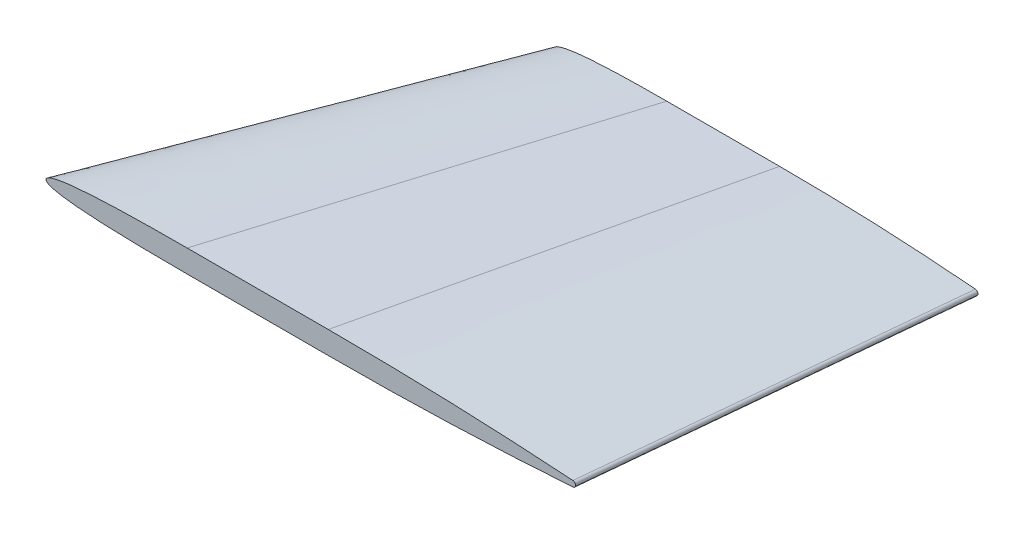
ISO-10303-21;
HEADER;
FILE_DESCRIPTION(('STEP AP214'),'2;1');
FILE_NAME('part.step','',(''),(''),'','','');
FILE_SCHEMA(('AUTOMOTIVE_DESIGN { 1 0 10303 214 1 1 1 1 }'));
ENDSEC;
DATA;
#1=APPLICATION_CONTEXT('core data for automotive mechanical design processes');
#2=APPLICATION_PROTOCOL_DEFINITION('international standard','automotive_design',2000,#1);
#3=PRODUCT_CONTEXT('',#1,'mechanical');
#4=PRODUCT('Part','Part','',(#3));
#5=PRODUCT_RELATED_PRODUCT_CATEGORY('part','',(#4));
#6=PRODUCT_DEFINITION_FORMATION('','',#4);
#7=PRODUCT_DEFINITION_CONTEXT('part definition',#1,'design');
#8=PRODUCT_DEFINITION('design','',#6,#7);
#9=PRODUCT_DEFINITION_SHAPE('','',#8);
#10=(LENGTH_UNIT() NAMED_UNIT(*) SI_UNIT(.MILLI.,.METRE.));
#11=(NAMED_UNIT(*) PLANE_ANGLE_UNIT() SI_UNIT($,.RADIAN.));
#12=(NAMED_UNIT(*) SI_UNIT($,.STERADIAN.) SOLID_ANGLE_UNIT());
#13=UNCERTAINTY_MEASURE_WITH_UNIT(LENGTH_MEASURE(1.E-05),#10,'distance_accuracy_value','');
#14=(GEOMETRIC_REPRESENTATION_CONTEXT(3) GLOBAL_UNCERTAINTY_ASSIGNED_CONTEXT((#13)) GLOBAL_UNIT_ASSIGNED_CONTEXT((#10,
#11,#12)) REPRESENTATION_CONTEXT('',''));
#15=CARTESIAN_POINT('',(0.,0.,0.));
#16=DIRECTION('',(0.,0.,1.));
#17=DIRECTION('',(1.,0.,0.));
#18=AXIS2_PLACEMENT_3D('',#15,#16,#17);
#19=CARTESIAN_POINT('',(0.,0.,0.));
#20=DIRECTION('',(0.,-1.,0.));
#21=DIRECTION('',(0.,0.,-1.));
#22=AXIS2_PLACEMENT_3D('',#19,#20,#21);
#23=PLANE('',#22);
#24=DIRECTION('',(-1.,0.,0.));
#25=VECTOR('',#24,1.);
#26=CARTESIAN_POINT('',(-33.3550389878657,0.,-28.8888888888889));
#27=LINE('',#26,#25);
#28=CARTESIAN_POINT('',(6.64496101213429,0.,-28.8888888888889));
#29=VERTEX_POINT('',#28);
#30=CARTESIAN_POINT('',(-13.3550389878657,0.,-28.8888888888889));
#31=VERTEX_POINT('',#30);
#32=EDGE_CURVE('E253',#29,#31,#27,.T.);
#33=ORIENTED_EDGE('',*,*,#32,.F.);
#34=DIRECTION('',(0.224164243499484,0.,-0.974551379833975));
#35=VECTOR('',#34,1.);
#36=CARTESIAN_POINT('',(-8.30620126516782,0.,36.1111111111111));
#37=LINE('',#36,#35);
#38=CARTESIAN_POINT('',(-8.30620126516782,0.,36.1111111111111));
#39=VERTEX_POINT('',#38);
#40=EDGE_CURVE('E264',#39,#29,#37,.T.);
#41=ORIENTED_EDGE('',*,*,#40,.F.);
#42=DIRECTION('',(1.,0.,0.));
#43=VECTOR('',#42,1.);
#44=CARTESIAN_POINT('',(-58.3062012651678,0.,36.1111111111111));
#45=LINE('',#44,#43);
#46=CARTESIAN_POINT('',(-33.3062012651678,0.,36.1111111111111));
#47=VERTEX_POINT('',#46);
#48=EDGE_CURVE('E237',#47,#39,#45,.T.);
#49=ORIENTED_EDGE('',*,*,#48,.F.);
#50=DIRECTION('',(0.293429624995853,0.,-0.955980677197397));
#51=VECTOR('',#50,1.);
#52=CARTESIAN_POINT('',(-23.3306201265168,0.,3.61111111111109));
#53=LINE('',#52,#51);
#54=EDGE_CURVE('E473',#47,#31,#53,.T.);
#55=ORIENTED_EDGE('',*,*,#54,.T.);
#56=EDGE_LOOP('',(#33,#41,#49,#55));
#57=FACE_BOUND('',#56,.T.);
#58=ADVANCED_FACE('F136',(#57),#23,.T.);
#59=CARTESIAN_POINT('',(0.,4.,0.));
#60=DIRECTION('',(0.,-1.,0.));
#61=DIRECTION('',(0.,0.,-1.));
#62=AXIS2_PLACEMENT_3D('',#59,#60,#61);
#63=PLANE('',#62);
#64=DIRECTION('',(1.,0.,0.));
#65=VECTOR('',#64,1.);
#66=CARTESIAN_POINT('',(-58.3062012651678,4.,36.1111111111111));
#67=LINE('',#66,#65);
#68=CARTESIAN_POINT('',(-33.3062012651678,4.,36.1111111111111));
#69=VERTEX_POINT('',#68);
#70=CARTESIAN_POINT('',(-8.30620126516782,4.,36.1111111111111));
#71=VERTEX_POINT('',#70);
#72=EDGE_CURVE('E220',#69,#71,#67,.T.);
#73=ORIENTED_EDGE('',*,*,#72,.T.);
#74=DIRECTION('',(0.224164243499484,0.,-0.974551379833975));
#75=VECTOR('',#74,1.);
#76=CARTESIAN_POINT('',(-0.830620126516762,4.,3.61111111111109));
#77=LINE('',#76,#75);
#78=CARTESIAN_POINT('',(6.64496101213429,4.,-28.8888888888889));
#79=VERTEX_POINT('',#78);
#80=EDGE_CURVE('E204',#71,#79,#77,.T.);
#81=ORIENTED_EDGE('',*,*,#80,.T.);
#82=DIRECTION('',(-1.,0.,0.));
#83=VECTOR('',#82,1.);
#84=CARTESIAN_POINT('',(-33.3550389878657,4.,-28.8888888888889));
#85=LINE('',#84,#83);
#86=CARTESIAN_POINT('',(-13.3550389878657,4.,-28.8888888888889));
#87=VERTEX_POINT('',#86);
#88=EDGE_CURVE('E230',#79,#87,#85,.T.);
#89=ORIENTED_EDGE('',*,*,#88,.T.);
#90=CARTESIAN_POINT('',(-33.3062012651678,4.,36.1111111111111));
#91=CARTESIAN_POINT('',(-26.6558138394004,4.,14.4444444444444));
#92=CARTESIAN_POINT('',(-20.0054264136331,4.,-7.22222222222225));
#93=CARTESIAN_POINT('',(-13.3550389878657,4.,-28.8888888888889));
#94=B_SPLINE_CURVE_WITH_KNOTS('',3,(#90,#91,#92,#93),.UNSPECIFIED.,.F.,.F.,(4,4),(0.,1.),.UNSPECIFIED.);
#95=EDGE_CURVE('E227',#69,#87,#94,.T.);
#96=ORIENTED_EDGE('',*,*,#95,.F.);
#97=EDGE_LOOP('',(#73,#81,#89,#96));
#98=FACE_BOUND('',#97,.T.);
#99=ADVANCED_FACE('F225',(#98),#63,.F.);
#100=CARTESIAN_POINT('',(-33.3550389878657,4.,-28.8888888888889));
#101=DIRECTION('',(0.,0.,1.));
#102=DIRECTION('',(1.,0.,0.));
#103=AXIS2_PLACEMENT_3D('',#100,#101,#102);
#104=PLANE('',#103);
#105=CARTESIAN_POINT('',(6.64496101213429,4.,-28.8888888888889));
#106=CARTESIAN_POINT('',(26.7075815989268,3.99999999999999,-28.8888888888889));
#107=CARTESIAN_POINT('',(46.6449610121343,2.,-28.8888888888889));
#108=B_SPLINE_CURVE_WITH_KNOTS('',2,(#105,#106,#107),.UNSPECIFIED.,.F.,.F.,(3,3),(0.,1.),.UNSPECIFIED.);
#109=CARTESIAN_POINT('',(41.3223081265053,2.49810714427976,-28.8888888888889));
#110=VERTEX_POINT('',#109);
#111=EDGE_CURVE('E210',#79,#110,#108,.T.);
#112=ORIENTED_EDGE('',*,*,#111,.T.);
#113=CARTESIAN_POINT('',(33.3909188699103,1.50109511793039,52.9875880510615));
#114=CARTESIAN_POINT('',(33.8556739532687,1.53204951907019,53.0325568196128));
#115=CARTESIAN_POINT('',(33.8556739532687,2.,53.0325568196128));
#116=CARTESIAN_POINT('',(33.8556739532687,2.46795048092982,53.0325568196128));
#117=CARTESIAN_POINT('',(33.3909188699103,2.49890488206961,52.9875880510615));
#118=CARTESIAN_POINT('',(33.9357903842561,1.50113400681733,47.3620957396136));
#119=CARTESIAN_POINT('',(34.4005594628321,1.53258671892999,47.4009833435175));
#120=CARTESIAN_POINT('',(34.399976481118,2.,47.4070086539737));
#121=CARTESIAN_POINT('',(34.4005594628321,2.46741328107001,47.4009833435175));
#122=CARTESIAN_POINT('',(33.9357903842561,2.49886599318267,47.3620957396136));
#123=CARTESIAN_POINT('',(34.4806618986018,1.50117289570427,41.7366034281658));
#124=CARTESIAN_POINT('',(34.9448616786437,1.53312334372344,41.7754384028916));
#125=CARTESIAN_POINT('',(34.9442790089672,2.,41.7814604883346));
#126=CARTESIAN_POINT('',(34.9448616786437,2.46687665627656,41.7754384028916));
#127=CARTESIAN_POINT('',(34.4806618986018,2.49882710429573,41.7366034281658));
#128=CARTESIAN_POINT('',(35.0255334129476,1.50121178459121,36.1111111167179));
#129=CARTESIAN_POINT('',(35.4885815368165,1.53365939437345,36.1559123226954));
#130=CARTESIAN_POINT('',(35.4885815368165,2.,36.1559123226954));
#131=CARTESIAN_POINT('',(35.4885815368165,2.46634060562655,36.1559123226954));
#132=CARTESIAN_POINT('',(35.0255334129476,2.49878821540879,36.1111111167179));
#133=CARTESIAN_POINT('',(35.2867326437982,1.50123190428566,33.4144493650578));
#134=CARTESIAN_POINT('',(35.7494258821313,1.53392954979268,33.459924526602));
#135=CARTESIAN_POINT('',(35.7494938182606,2.,33.4592223939301));
#136=CARTESIAN_POINT('',(35.7494258821313,2.46607045020731,33.459924526602));
#137=CARTESIAN_POINT('',(35.2867326437983,2.49876809571434,33.4144493650578));
#138=CARTESIAN_POINT('',(35.5479353498855,1.50125275150569,30.7177879478035));
#139=CARTESIAN_POINT('',(36.0103300733508,1.53420615287485,30.7632815439024));
#140=CARTESIAN_POINT('',(36.0104025827426,1.99999999999999,30.7625321087959));
#141=CARTESIAN_POINT('',(36.0103300733508,2.46579384712514,30.7632815439024));
#142=CARTESIAN_POINT('',(35.5479353498855,2.49874724849431,30.7177879478035));
#143=CARTESIAN_POINT('',(36.6152497979493,1.50134131200847,19.6989764110302));
#144=CARTESIAN_POINT('',(37.0757783590313,1.53536423514882,19.7509000070185));
#145=CARTESIAN_POINT('',(37.076484676427,1.99999999999999,19.7435995228866));
#146=CARTESIAN_POINT('',(37.0757783590313,2.46463576485116,19.7509000070186));
#147=CARTESIAN_POINT('',(36.6152497979493,2.49865868799153,19.6989764110302));
#148=CARTESIAN_POINT('',(37.4213939611922,1.50141606960295,11.3768294097564));
#149=CARTESIAN_POINT('',(37.8808035970569,1.53630562046833,11.4298464434921));
#150=CARTESIAN_POINT('',(37.8816251712741,2.,11.4213538896227));
#151=CARTESIAN_POINT('',(37.8808035970569,2.46369437953166,11.4298464434921));
#152=CARTESIAN_POINT('',(37.4213939611922,2.49858393039705,11.3768294097564));
#153=CARTESIAN_POINT('',(39.0337740359984,1.50158713911264,-5.2674557777585));
#154=CARTESIAN_POINT('',(39.4909887282472,1.53835617633487,-5.21462534636621));
#155=CARTESIAN_POINT('',(39.4918130935012,2.,-5.22314685663467));
#156=CARTESIAN_POINT('',(39.4909887282472,2.46164382366514,-5.21462534636622));
#157=CARTESIAN_POINT('',(39.0337740359984,2.49841286088736,-5.2674557777585));
#158=CARTESIAN_POINT('',(39.8400099475616,1.50168345102785,-13.5895939639995));
#159=CARTESIAN_POINT('',(40.2958762840673,1.53946465811955,-13.5352264391393));
#160=CARTESIAN_POINT('',(40.2968605208813,2.,-13.5454019696281));
#161=CARTESIAN_POINT('',(40.2958762840673,2.46053534188045,-13.5352264391394));
#162=CARTESIAN_POINT('',(39.8400099475616,2.49831654897215,-13.5895939639996));
#163=CARTESIAN_POINT('',(40.8716352268414,1.50182658103805,-24.2374476776984));
#164=CARTESIAN_POINT('',(41.3267354628827,1.54102411342373,-24.1926504852983));
#165=CARTESIAN_POINT('',(41.3268099641106,2.,-24.1934206782379));
#166=CARTESIAN_POINT('',(41.3267354628827,2.45897588657627,-24.1926504852983));
#167=CARTESIAN_POINT('',(40.8716352268414,2.49817341896195,-24.2374476776985));
#168=CARTESIAN_POINT('',(41.096969170969,1.50185905858814,-26.5631685215788));
#169=CARTESIAN_POINT('',(41.5516909964834,1.54137291731147,-26.5183783361045));
#170=CARTESIAN_POINT('',(41.5517683949961,2.,-26.5191785000808));
#171=CARTESIAN_POINT('',(41.5516909964834,2.45862708268853,-26.5183783361045));
#172=CARTESIAN_POINT('',(41.096969170969,2.49814094141186,-26.5631685215788));
#173=CARTESIAN_POINT('',(41.3223081212226,1.50189285529066,-28.8888888854068));
#174=CARTESIAN_POINT('',(41.7767217266876,1.54173089142601,-28.8449368442894));
#175=CARTESIAN_POINT('',(41.7767217266876,2.,-28.8449368442894));
#176=CARTESIAN_POINT('',(41.7767217266876,2.45826910857399,-28.8449368442894));
#177=CARTESIAN_POINT('',(41.3223081212226,2.49810714470934,-28.8888888854068));
#178=CARTESIAN_POINT('',(41.9033364257423,1.50198999615669,-34.8852941136153));
#179=CARTESIAN_POINT('',(42.3578244484341,1.54272126400079,-34.8532590438483));
#180=CARTESIAN_POINT('',(42.3566820617981,2.,-34.8414473163708));
#181=CARTESIAN_POINT('',(42.3578244484341,2.4572787359992,-34.8532590438483));
#182=CARTESIAN_POINT('',(41.9033364257423,2.49801000384331,-34.8852941136153));
#183=CARTESIAN_POINT('',(42.484364730262,1.50208713702272,-40.8816993418238));
#184=CARTESIAN_POINT('',(42.937783659534,1.54370968769194,-40.8497578942012));
#185=CARTESIAN_POINT('',(42.9366423969086,1.99999999999999,-40.8379577884522));
#186=CARTESIAN_POINT('',(42.937783659534,2.45629031230805,-40.8497578942012));
#187=CARTESIAN_POINT('',(42.484364730262,2.49791286297728,-40.8816993418238));
#188=CARTESIAN_POINT('',(43.0653930347817,1.50218427788875,-46.8781045700323));
#189=CARTESIAN_POINT('',(43.5166027320191,1.5446961682464,-46.8344682605337));
#190=CARTESIAN_POINT('',(43.5166027320191,1.99999999999999,-46.8344682605337));
#191=CARTESIAN_POINT('',(43.5166027320191,2.45530383175358,-46.8344682605337));
#192=CARTESIAN_POINT('',(43.0653930347817,2.49781572211125,-46.8781045700323));
#193=(BOUNDED_SURFACE() B_SPLINE_SURFACE(3,2,((#113,#114,#115,#116,#117),(#118,#119,#120,#121,
#122),(#123,#124,#125,#126,#127),(#128,#129,#130,#131,#132),(#133,#134,#135,#136,#137),(#138,
#139,#140,#141,#142),(#143,#144,#145,#146,#147),(#148,#149,#150,#151,#152),(#153,#154,#155,#156,
#157),(#158,#159,#160,#161,#162),(#163,#164,#165,#166,#167),(#168,#169,#170,#171,#172),(#173,
#174,#175,#176,#177),(#178,#179,#180,#181,#182),(#183,#184,#185,#186,#187),(#188,#189,#190,#191,
#192)),.UNSPECIFIED.,.F.,.F.,.F.) B_SPLINE_SURFACE_WITH_KNOTS((4,3,2,2,2,3,4),(3,2,3),(0.,
16.9554542718288,25.08330051281,50.1666010274149,75.2499015413038,82.2597354631119,
100.333202055722),(0.,0.5,1.),
.UNSPECIFIED.) GEOMETRIC_REPRESENTATION_ITEM() RATIONAL_B_SPLINE_SURFACE(((1.,0.730119470357136,
1.,0.730119470357136,1.),(1.,0.730510681446054,1.,0.730510681446054,1.),(1.,0.730901892534972,
1.,0.730901892534972,1.),(1.,0.73129310362389,1.,0.73129310362389,1.),(1.,0.731490237432423,1.,
0.731490237432423,1.),(1.,0.731692099676059,1.,0.731692099676059,1.),(1.,0.7325380447988,1.,
0.7325380447988,1.),(1.,0.733226179619518,1.,0.733226179619518,1.),(1.,0.734726728585382,1.,
0.734726728585382,1.),(1.,0.735539142730524,1.,0.735539142730524,1.),(1.,0.736682435951583,1.,
0.736682435951583,1.),(1.,0.736938494347952,1.,0.736938494347952,1.),(1.,0.737201306315002,1.,
0.737201306315002,1.),(1.,0.737928079445219,1.,0.737928079445219,1.),(1.,0.738654852575435,1.,
0.738654852575435,1.),(1.,0.739381625705651,1.,0.739381625705651,1.))) REPRESENTATION_ITEM('') SURFACE());
#194=CARTESIAN_POINT('',(41.3223081265053,2.49810714427976,-28.8888888888889));
#195=CARTESIAN_POINT('',(41.3505402720704,2.49567853364434,-28.8888888888889));
#196=CARTESIAN_POINT('',(41.3785559429119,2.49082722932282,-28.8888888888889));
#197=CARTESIAN_POINT('',(41.4333686906741,2.47651789198199,-28.8888888888889));
#198=CARTESIAN_POINT('',(41.4601664604544,2.46706251499781,-28.8888888888889));
#199=CARTESIAN_POINT('',(41.511805654467,2.44377422399758,-28.8888888888889));
#200=CARTESIAN_POINT('',(41.5366460417051,2.42993900881986,-28.8888888888889));
#201=CARTESIAN_POINT('',(41.5836387269361,2.3982892901109,-28.8888888888889));
#202=CARTESIAN_POINT('',(41.6057916714791,2.38047574663511,-28.8888888888889));
#203=CARTESIAN_POINT('',(41.646724303476,2.34141454320186,-28.8888888888889));
#204=CARTESIAN_POINT('',(41.665512200298,2.32017548776267,-28.8888888888889));
#205=CARTESIAN_POINT('',(41.6992393910847,2.27482918809371,-28.8888888888889));
#206=CARTESIAN_POINT('',(41.7141781693849,2.25072156019449,-28.8888888888889));
#207=CARTESIAN_POINT('',(41.7397062665268,2.2004433331789,-28.8888888888889));
#208=CARTESIAN_POINT('',(41.7503152188639,2.1742827024391,-28.8888888888889));
#209=CARTESIAN_POINT('',(41.7669717002757,2.12054924563584,-28.8888888888889));
#210=CARTESIAN_POINT('',(41.7730196030386,2.09297653546218,-28.8888888888889));
#211=CARTESIAN_POINT('',(41.7803628254913,2.03730963801455,-28.8888888888889));
#212=CARTESIAN_POINT('',(41.7816756751353,2.00921776202199,-28.8888888888889));
#213=CARTESIAN_POINT('',(41.7795602753897,1.95321314889351,-28.8888888888889));
#214=CARTESIAN_POINT('',(41.7761320536345,1.92530041071439,-28.8888888888889));
#215=CARTESIAN_POINT('',(41.7646413378686,1.87048414285943,-28.8888888888889));
#216=CARTESIAN_POINT('',(41.7565848921379,1.84357934476814,-28.8888888888889));
#217=CARTESIAN_POINT('',(41.7360770655952,1.79149976362352,-28.8888888888889));
#218=CARTESIAN_POINT('',(41.7236255274781,1.76632504253013,-28.8888888888889));
#219=CARTESIAN_POINT('',(41.6946614543826,1.71837270960812,-28.8888888888889));
#220=CARTESIAN_POINT('',(41.6781419642779,1.69559929964118,-28.8888888888889));
#221=CARTESIAN_POINT('',(41.6415286682265,1.65313602142374,-28.8888888888889));
#222=CARTESIAN_POINT('',(41.621434964174,1.6334460652998,-28.8888888888889));
#223=CARTESIAN_POINT('',(41.5781582768794,1.59762196567907,-28.8888888888889));
#224=CARTESIAN_POINT('',(41.5549630747096,1.58150259308385,-28.8888888888889));
#225=CARTESIAN_POINT('',(41.5062037710051,1.55336728674541,-28.8888888888889));
#226=CARTESIAN_POINT('',(41.4806400052036,1.54135077256847,-28.8888888888889));
#227=CARTESIAN_POINT('',(41.4330553781227,1.52367602593746,-28.8888888888889));
#228=CARTESIAN_POINT('',(41.4113218339911,1.51723328096708,-28.8888888888889));
#229=CARTESIAN_POINT('',(41.367208082177,1.50731722361928,-28.8888888888889));
#230=CARTESIAN_POINT('',(41.3448284658996,1.5038412793366,-28.8888888888889));
#231=CARTESIAN_POINT('',(41.3223081265053,1.50189285572024,-28.8888888888889));
#232=B_SPLINE_CURVE_WITH_KNOTS('',3,(#194,#195,#196,#197,#198,#199,#200,#201,#202,#203,#204,
#205,#206,#207,#208,#209,#210,#211,#212,#213,#214,#215,#216,#217,#218,#219,#220,#221,#222,#223,
#224,#225,#226,#227,#228,#229,#230,#231),.UNSPECIFIED.,.F.,.F.,(4,2,2,2,2,2,2,2,2,2,2,2,2,2,2,2,
2,2,4),(0.,0.084898538104682,0.169748157167299,0.254642430311183,0.339516238751376,
0.424180081843134,0.508855261416306,0.593142099355288,0.677422030897451,0.761389621981536,
0.84535672364235,0.929214343785458,1.01307496559094,1.09707997476887,1.1810825895038,
1.2654264750701,1.34975842351019,1.41756562240343,1.48531260553501),.UNSPECIFIED.);
#233=CARTESIAN_POINT('',(41.3223081265053,1.50189285572024,-28.8888888888889));
#234=VERTEX_POINT('',#233);
#235=EDGE_CURVE('E165',#110,#234,#232,.T.);
#236=ORIENTED_EDGE('',*,*,#235,.T.);
#237=CARTESIAN_POINT('',(6.64496101213429,0.,-28.8888888888889));
#238=CARTESIAN_POINT('',(26.7075815989268,0.,-28.8888888888889));
#239=CARTESIAN_POINT('',(46.6449610121343,2.,-28.8888888888889));
#240=B_SPLINE_CURVE_WITH_KNOTS('',2,(#237,#238,#239),.UNSPECIFIED.,.F.,.F.,(3,3),(0.,1.),.UNSPECIFIED.);
#241=EDGE_CURVE('E269',#29,#234,#240,.T.);
#242=ORIENTED_EDGE('',*,*,#241,.F.);
#243=ORIENTED_EDGE('',*,*,#32,.T.);
#244=CARTESIAN_POINT('',(-33.3550389878657,2.,-28.8888888888889));
#245=CARTESIAN_POINT('',(-33.4768817300547,-0.000156597654709864,-28.8888888888889));
#246=CARTESIAN_POINT('',(-13.3550389878657,0.,-28.8888888888889));
#247=B_SPLINE_CURVE_WITH_KNOTS('',2,(#244,#245,#246),.UNSPECIFIED.,.F.,.F.,(3,3),(0.,1.),.UNSPECIFIED.);
#248=CARTESIAN_POINT('',(-33.3550389878657,1.95213566414585,-28.8888888888889));
#249=VERTEX_POINT('',#248);
#250=EDGE_CURVE('E258',#249,#31,#247,.T.);
#251=ORIENTED_EDGE('',*,*,#250,.F.);
#252=DIRECTION('',(0.,-1.,0.));
#253=VECTOR('',#252,1.);
#254=CARTESIAN_POINT('',(-33.3550389878657,4.,-28.8888888888889));
#255=LINE('',#254,#253);
#256=CARTESIAN_POINT('',(-33.3550389878657,2.04786433585425,-28.8888888888889));
#257=VERTEX_POINT('',#256);
#258=EDGE_CURVE('E229',#257,#249,#255,.T.);
#259=ORIENTED_EDGE('',*,*,#258,.F.);
#260=CARTESIAN_POINT('',(-33.3550389878657,2.,-28.8888888888889));
#261=CARTESIAN_POINT('',(-33.4768817300547,4.00015659765471,-28.8888888888889));
#262=CARTESIAN_POINT('',(-13.3550389878657,4.,-28.8888888888889));
#263=B_SPLINE_CURVE_WITH_KNOTS('',2,(#260,#261,#262),.UNSPECIFIED.,.F.,.F.,(3,3),(0.,1.),.UNSPECIFIED.);
#264=EDGE_CURVE('E257',#257,#87,#263,.T.);
#265=ORIENTED_EDGE('',*,*,#264,.T.);
#266=ORIENTED_EDGE('',*,*,#88,.F.);
#267=EDGE_LOOP('',(#112,#236,#242,#243,#251,#259,#265,#266));
#268=FACE_BOUND('',#267,.T.);
#269=ADVANCED_FACE('F319',(#268),#104,.F.);
#270=CARTESIAN_POINT('',(-58.3062012651678,4.,36.1111111111111));
#271=DIRECTION('',(0.933580426497201,0.,0.358367949545301));
#272=DIRECTION('',(0.358367949545301,0.,-0.933580426497201));
#273=AXIS2_PLACEMENT_3D('',#270,#271,#272);
#274=PLANE('',#273);
#275=ORIENTED_EDGE('',*,*,#258,.T.);
#276=DIRECTION('',(0.358367864861597,-0.000687464561868342,-0.933580205888608));
#277=VECTOR('',#276,1.);
#278=CARTESIAN_POINT('',(-58.3062012651678,2.,36.1111111111111));
#279=LINE('',#278,#277);
#280=CARTESIAN_POINT('',(-58.3057212466994,2.00600220058824,36.1111111111111));
#281=VERTEX_POINT('',#280);
#282=EDGE_CURVE('E393',#281,#249,#279,.T.);
#283=ORIENTED_EDGE('',*,*,#282,.F.);
#284=CARTESIAN_POINT('',(-58.3062012651678,2.,36.1111111111111));
#285=CARTESIAN_POINT('',(-49.9891471727338,2.01595477861808,14.4444444444444));
#286=CARTESIAN_POINT('',(-41.6720930802997,2.03190955723617,-7.22222222222225));
#287=CARTESIAN_POINT('',(-33.3550389878657,2.04786433585425,-28.8888888888889));
#288=B_SPLINE_CURVE_WITH_KNOTS('',3,(#284,#285,#286,#287),.UNSPECIFIED.,.F.,.F.,(4,4),(0.,1.),.UNSPECIFIED.);
#289=EDGE_CURVE('E413',#281,#257,#288,.T.);
#290=ORIENTED_EDGE('',*,*,#289,.T.);
#291=EDGE_LOOP('',(#275,#283,#290));
#292=FACE_BOUND('',#291,.T.);
#293=ADVANCED_FACE('F362',(#292),#274,.F.);
#294=CARTESIAN_POINT('',(-58.3062012651678,4.,36.1111111111111));
#295=DIRECTION('',(0.,0.,-1.));
#296=DIRECTION('',(-1.,0.,0.));
#297=AXIS2_PLACEMENT_3D('',#294,#295,#296);
#298=PLANE('',#297);
#299=CARTESIAN_POINT('',(-8.30620126516782,0.,36.1111111111111));
#300=CARTESIAN_POINT('',(16.7498473667231,0.,36.1111111111111));
#301=CARTESIAN_POINT('',(41.6937987348322,2.,36.1111111111111));
#302=B_SPLINE_CURVE_WITH_KNOTS('',2,(#299,#300,#301),.UNSPECIFIED.,.F.,.F.,(3,3),(0.,1.),.UNSPECIFIED.);
#303=CARTESIAN_POINT('',(35.0255334183462,1.50121178492834,36.1111111111111));
#304=VERTEX_POINT('',#303);
#305=EDGE_CURVE('E261',#39,#304,#302,.T.);
#306=ORIENTED_EDGE('',*,*,#305,.T.);
#307=CARTESIAN_POINT('',(35.0255334183462,1.50121178492834,36.1111111111111));
#308=CARTESIAN_POINT('',(35.0538077425884,1.50315117254618,36.1111111111111));
#309=CARTESIAN_POINT('',(35.0819074689639,1.50751728396283,36.1111111111111));
#310=CARTESIAN_POINT('',(35.1369679680579,1.52087748133869,36.1111111111111));
#311=CARTESIAN_POINT('',(35.1639293917425,1.52986888233411,36.1111111111111));
#312=CARTESIAN_POINT('',(35.2159717172991,1.55226280527861,36.1111111111111));
#313=CARTESIAN_POINT('',(35.2410516281803,1.5656676320226,36.1111111111111));
#314=CARTESIAN_POINT('',(35.2885924803909,1.59650293694562,36.1111111111111));
#315=CARTESIAN_POINT('',(35.3110540473669,1.61393245045661,36.1111111111111));
#316=CARTESIAN_POINT('',(35.3526655705573,1.65228500302093,36.1111111111111));
#317=CARTESIAN_POINT('',(35.3718233417528,1.67319956113345,36.1111111111111));
#318=CARTESIAN_POINT('',(35.4063395440824,1.71796398243105,36.1111111111111));
#319=CARTESIAN_POINT('',(35.4216974670173,1.74181423760398,36.1111111111111));
#320=CARTESIAN_POINT('',(35.4480997517741,1.7916534689536,36.1111111111111));
#321=CARTESIAN_POINT('',(35.4591635289321,1.81763216001298,36.1111111111111));
#322=CARTESIAN_POINT('',(35.4767529014276,1.87108123600418,36.1111111111111));
#323=CARTESIAN_POINT('',(35.4832788676832,1.89855149881785,36.1111111111111));
#324=CARTESIAN_POINT('',(35.4915861870751,1.95409341398183,36.1111111111111));
#325=CARTESIAN_POINT('',(35.4933854522653,1.98216238839105,36.1111111111111));
#326=CARTESIAN_POINT('',(35.4922385390779,2.03820308837425,36.1111111111111));
#327=CARTESIAN_POINT('',(35.4892924055017,2.06617481486385,36.1111111111111));
#328=CARTESIAN_POINT('',(35.4787486928556,2.12118463362692,36.1111111111111));
#329=CARTESIAN_POINT('',(35.4711579107686,2.14822402930732,36.1111111111111));
#330=CARTESIAN_POINT('',(35.4515511228202,2.20064881390558,36.1111111111111));
#331=CARTESIAN_POINT('',(35.4395349025023,2.22603412259629,36.1111111111111));
#332=CARTESIAN_POINT('',(35.4114019940659,2.27447456543961,36.1111111111111));
#333=CARTESIAN_POINT('',(35.3952787827068,2.29752591033143,36.1111111111111));
#334=CARTESIAN_POINT('',(35.3594066087624,2.34060558974565,36.1111111111111));
#335=CARTESIAN_POINT('',(35.339657955273,2.36063418171517,36.1111111111111));
#336=CARTESIAN_POINT('',(35.2970137825936,2.39718705475182,36.1111111111111));
#337=CARTESIAN_POINT('',(35.2741062605721,2.41369732714511,36.1111111111111));
#338=CARTESIAN_POINT('',(35.2258510469051,2.44266026111046,36.1111111111111));
#339=CARTESIAN_POINT('',(35.2005031930424,2.45511265269978,36.1111111111111));
#340=CARTESIAN_POINT('',(35.1505363928739,2.4746544446352,36.1111111111111));
#341=CARTESIAN_POINT('',(35.1260695469524,2.48213540242532,36.1111111111111));
#342=CARTESIAN_POINT('',(35.0762938526513,2.49332553562059,36.1111111111111));
#343=CARTESIAN_POINT('',(35.0509851803436,2.49703549468803,36.1111111111111));
#344=CARTESIAN_POINT('',(35.0255334183462,2.49878821507166,36.1111111111111));
#345=B_SPLINE_CURVE_WITH_KNOTS('',3,(#307,#308,#309,#310,#311,#312,#313,#314,#315,#316,#317,
#318,#319,#320,#321,#322,#323,#324,#325,#326,#327,#328,#329,#330,#331,#332,#333,#334,#335,#336,
#337,#338,#339,#340,#341,#342,#343,#344),.UNSPECIFIED.,.F.,.F.,(4,2,2,2,2,2,2,2,2,2,2,2,2,2,2,2,
2,2,4),(0.,0.0849114096274301,0.169773584020257,0.254680145920221,0.339566377844655,
0.424248975702892,0.508942893063762,0.593249290189862,0.677548795350038,0.761528379686311,
0.845507171176327,0.929363360973853,1.01322361497298,1.09721790610086,1.18120503941358,
1.26552057662037,1.34984172244263,1.42630715515078,1.50275669410247),.UNSPECIFIED.);
#346=CARTESIAN_POINT('',(35.0255334183462,2.49878821507166,36.1111111111111));
#347=VERTEX_POINT('',#346);
#348=EDGE_CURVE('E13',#304,#347,#345,.T.);
#349=ORIENTED_EDGE('',*,*,#348,.T.);
#350=CARTESIAN_POINT('',(-8.30620126516782,4.,36.1111111111111));
#351=CARTESIAN_POINT('',(16.749847366723,4.,36.1111111111111));
#352=CARTESIAN_POINT('',(41.6937987348322,2.,36.1111111111111));
#353=B_SPLINE_CURVE_WITH_KNOTS('',2,(#350,#351,#352),.UNSPECIFIED.,.F.,.F.,(3,3),(0.,1.),.UNSPECIFIED.);
#354=EDGE_CURVE('E208',#71,#347,#353,.T.);
#355=ORIENTED_EDGE('',*,*,#354,.F.);
#356=ORIENTED_EDGE('',*,*,#72,.F.);
#357=CARTESIAN_POINT('',(-58.3062012651678,2.,36.1111111111111));
#358=CARTESIAN_POINT('',(-58.2981682863197,2.13185803387447,36.1111111111111));
#359=CARTESIAN_POINT('',(-58.1165495380854,2.3512782454784,36.1111111111111));
#360=CARTESIAN_POINT('',(-57.6523540562812,2.59937777239834,36.1111111111111));
#361=CARTESIAN_POINT('',(-57.0197515682006,2.80617439716223,36.111111111111));
#362=CARTESIAN_POINT('',(-56.3769150244662,2.95010416964718,36.1111111111111));
#363=CARTESIAN_POINT('',(-55.8568799760318,3.04843051159478,36.1111111111111));
#364=CARTESIAN_POINT('',(-55.3359662965872,3.13504754543367,36.1111111111111));
#365=CARTESIAN_POINT('',(-54.6818489795878,3.2286430482675,36.1111111111111));
#366=CARTESIAN_POINT('',(-53.6326085869534,3.35434667278868,36.111111111111));
#367=CARTESIAN_POINT('',(-52.3173026060738,3.47915567883608,36.1111111111111));
#368=CARTESIAN_POINT('',(-50.736341932929,3.59550791665806,36.1111111111111));
#369=CARTESIAN_POINT('',(-49.1537633268491,3.68800069592947,36.1111111111111));
#370=CARTESIAN_POINT('',(-47.5702823950901,3.76243746410943,36.1111111111111));
#371=CARTESIAN_POINT('',(-45.9861816087334,3.82258876530267,36.1111111111111));
#372=CARTESIAN_POINT('',(-44.4016961914234,3.87109571460881,36.111111111111));
#373=CARTESIAN_POINT('',(-42.8169399486991,3.90986090614081,36.1111111111111));
#374=CARTESIAN_POINT('',(-41.2320059940613,3.94034760640304,36.1111111111111));
#375=CARTESIAN_POINT('',(-39.1186009927976,3.97140917344184,36.1111111111111));
#376=CARTESIAN_POINT('',(-36.4766432024574,3.99460959973483,36.1111111111111));
#377=CARTESIAN_POINT('',(-34.3630212451883,4.,36.1111111111111));
#378=CARTESIAN_POINT('',(-33.3062012651678,4.,36.1111111111111));
#379=B_SPLINE_CURVE_WITH_KNOTS('',3,(#357,#358,#359,#360,#361,#362,#363,#364,#365,#366,#367,
#368,#369,#370,#371,#372,#373,#374,#375,#376,#377,#378),.UNSPECIFIED.,.F.,.F.,(4,1,1,1,1,1,1,1,
1,1,1,1,1,1,1,1,1,1,1,4),(0.474821972073358,0.48236939656901,0.489916821064662,
0.505011670055968,0.520106519047273,0.527653943542926,0.535201368038578,0.550296217029883,
0.565391066021188,0.595580764003799,0.625770461986409,0.655960159969019,0.68614985795163,
0.71633955593424,0.74652925391685,0.776718951899461,0.806908649882071,0.837098347864681,
0.897477743829902,0.957857139795123),.UNSPECIFIED.);
#380=EDGE_CURVE('E414',#281,#69,#379,.T.);
#381=ORIENTED_EDGE('',*,*,#380,.F.);
#382=CARTESIAN_POINT('',(-58.3062012651678,2.,36.1111111111111));
#383=CARTESIAN_POINT('',(-58.1843584223458,0.,36.1111111111111));
#384=CARTESIAN_POINT('',(-33.3062012651678,0.,36.1111111111111));
#385=B_SPLINE_CURVE_WITH_KNOTS('',2,(#382,#383,#384),.UNSPECIFIED.,.F.,.F.,(3,3),(0.,1.),.UNSPECIFIED.);
#386=EDGE_CURVE('E275',#281,#47,#385,.T.);
#387=ORIENTED_EDGE('',*,*,#386,.T.);
#388=ORIENTED_EDGE('',*,*,#48,.T.);
#389=EDGE_LOOP('',(#306,#349,#355,#356,#381,#387,#388));
#390=FACE_BOUND('',#389,.T.);
#391=ADVANCED_FACE('F218',(#390),#298,.F.);
#392=CARTESIAN_POINT('',(-33.3062012651678,4.,36.1111111111111));
#393=CARTESIAN_POINT('',(-26.6558138394004,4.,14.4444444444444));
#394=CARTESIAN_POINT('',(-20.0054264136331,4.,-7.22222222222225));
#395=CARTESIAN_POINT('',(-13.3550389878657,4.,-28.8888888888889));
#396=CARTESIAN_POINT('',(-34.3630212451883,4.,36.1111111111111));
#397=CARTESIAN_POINT('',(-27.6437050924178,4.00000220512109,14.4444444444444));
#398=CARTESIAN_POINT('',(-20.9243889396473,4.00000441024218,-7.22222222222225));
#399=CARTESIAN_POINT('',(-14.2050727868767,4.00000661536327,-28.8888888888889));
#400=CARTESIAN_POINT('',(-36.4766432024574,3.99460959973483,36.1111111111111));
#401=CARTESIAN_POINT('',(-29.6194695161449,3.99463775263086,14.4444444444444));
#402=CARTESIAN_POINT('',(-22.7622958298324,3.99466590552689,-7.22222222222229));
#403=CARTESIAN_POINT('',(-15.9051221435198,3.99469405842292,-28.888888888889));
#404=CARTESIAN_POINT('',(-39.1186009927976,3.97140917344184,36.1111111111111));
#405=CARTESIAN_POINT('',(-32.089098820084,3.97151779060535,14.4444444444444));
#406=CARTESIAN_POINT('',(-25.0595966473703,3.97162640776887,-7.22222222222222));
#407=CARTESIAN_POINT('',(-18.0300944746567,3.97173502493238,-28.8888888888889));
#408=CARTESIAN_POINT('',(-41.2320059940613,3.94034760640304,36.1111111111111));
#409=CARTESIAN_POINT('',(-34.0646305759387,3.94056543392277,14.4444444444444));
#410=CARTESIAN_POINT('',(-26.897255157816,3.94078326144251,-7.22222222222226));
#411=CARTESIAN_POINT('',(-19.7298797396933,3.94100108896224,-28.8888888888889));
#412=CARTESIAN_POINT('',(-42.8169399486991,3.90986090614081,36.1111111111111));
#413=CARTESIAN_POINT('',(-35.5461489412502,3.91016607124094,14.4444444444444));
#414=CARTESIAN_POINT('',(-28.2753579338012,3.91047123634108,-7.22222222222225));
#415=CARTESIAN_POINT('',(-21.0045669263523,3.91077640144122,-28.8888888888889));
#416=CARTESIAN_POINT('',(-44.4016961914234,3.87109571460881,36.111111111111));
#417=CARTESIAN_POINT('',(-37.0274797571859,3.87152600887994,14.4444444444444));
#418=CARTESIAN_POINT('',(-29.6532633229484,3.87195630315108,-7.22222222222225));
#419=CARTESIAN_POINT('',(-22.2790468887108,3.87238659742221,-28.8888888888889));
#420=CARTESIAN_POINT('',(-45.9861816087334,3.82258876530267,36.1111111111111));
#421=CARTESIAN_POINT('',(-38.5085131135605,3.8231342906061,14.4444444444445));
#422=CARTESIAN_POINT('',(-31.0308446183875,3.82367981590953,-7.22222222222224));
#423=CARTESIAN_POINT('',(-23.5531761232145,3.82422534121296,-28.8888888888889));
#424=CARTESIAN_POINT('',(-47.5702823950901,3.76243746410943,36.1111111111111));
#425=CARTESIAN_POINT('',(-39.9891437491009,3.7631572417232,14.4444444444444));
#426=CARTESIAN_POINT('',(-32.4080051031118,3.76387701933697,-7.22222222222224));
#427=CARTESIAN_POINT('',(-24.8268664571226,3.76459679695074,-28.8888888888889));
#428=CARTESIAN_POINT('',(-49.1537633268491,3.68800069592947,36.1111111111111));
#429=CARTESIAN_POINT('',(-41.4690859581669,3.68883193031736,14.4444444444444));
#430=CARTESIAN_POINT('',(-33.7844085894847,3.68966316470525,-7.22222222222226));
#431=CARTESIAN_POINT('',(-26.0997312208026,3.69049439909314,-28.888888888889));
#432=CARTESIAN_POINT('',(-50.736341932929,3.59550791665806,36.1111111111111));
#433=CARTESIAN_POINT('',(-42.9480945432847,3.59659226203683,14.4444444444444));
#434=CARTESIAN_POINT('',(-35.1598471536404,3.59767660741561,-7.22222222222222));
#435=CARTESIAN_POINT('',(-27.3715997639962,3.59876095279438,-28.8888888888889));
#436=CARTESIAN_POINT('',(-52.3173026060738,3.47915567883608,36.1111111111111));
#437=CARTESIAN_POINT('',(-44.4252767009301,3.48020530084008,14.4444444444444));
#438=CARTESIAN_POINT('',(-36.5332507957864,3.48125492284408,-7.22222222222225));
#439=CARTESIAN_POINT('',(-28.6412248906427,3.48230454484808,-28.8888888888889));
#440=CARTESIAN_POINT('',(-53.6326085869534,3.35434667278868,36.111111111111));
#441=CARTESIAN_POINT('',(-45.6540402137099,3.35574828371843,14.4444444444444));
#442=CARTESIAN_POINT('',(-37.6754718404665,3.35714989464818,-7.22222222222227));
#443=CARTESIAN_POINT('',(-29.696903467223,3.35855150557793,-28.8888888888889));
#444=CARTESIAN_POINT('',(-54.6818489795878,3.2286430482675,36.1111111111111));
#445=CARTESIAN_POINT('',(-46.6336881152799,3.22976733915845,14.4444444444445));
#446=CARTESIAN_POINT('',(-38.585527250972,3.2308916300494,-7.22222222222223));
#447=CARTESIAN_POINT('',(-30.5373663866641,3.23201592094035,-28.8888888888889));
#448=CARTESIAN_POINT('',(-55.3359662965872,3.13504754543367,36.1111111111111));
#449=CARTESIAN_POINT('',(-47.2440557080312,3.13601287809875,14.4444444444444));
#450=CARTESIAN_POINT('',(-39.1521451194752,3.13697821076383,-7.22222222222225));
#451=CARTESIAN_POINT('',(-31.0602345309192,3.1379435434289,-28.8888888888889));
#452=CARTESIAN_POINT('',(-55.8568799760318,3.04843051159478,36.1111111111111));
#453=CARTESIAN_POINT('',(-47.730134522456,3.04948159612638,14.4444444444444));
#454=CARTESIAN_POINT('',(-39.6033890688803,3.05053268065798,-7.22222222222224));
#455=CARTESIAN_POINT('',(-31.4766436153046,3.05158376518958,-28.8888888888889));
#456=CARTESIAN_POINT('',(-56.3769150244662,2.95010416964718,36.1111111111111));
#457=CARTESIAN_POINT('',(-48.2147587346793,2.9514713601396,14.4444444444444));
#458=CARTESIAN_POINT('',(-40.0526024448925,2.95283855063201,-7.22222222222225));
#459=CARTESIAN_POINT('',(-31.8904461551057,2.95420574112442,-28.8888888888889));
#460=CARTESIAN_POINT('',(-57.0197515682006,2.80617439716223,36.111111111111));
#461=CARTESIAN_POINT('',(-48.813261570947,2.80579697626944,14.4444444444444));
#462=CARTESIAN_POINT('',(-40.6067715736933,2.80541955537664,-7.22222222222228));
#463=CARTESIAN_POINT('',(-32.4002815764396,2.80504213448384,-28.8888888888889));
#464=CARTESIAN_POINT('',(-57.6523540562812,2.59937777239834,36.1111111111111));
#465=CARTESIAN_POINT('',(-49.3993956065292,2.59998699851085,14.4444444444444));
#466=CARTESIAN_POINT('',(-41.1464371567771,2.60059622462336,-7.22222222222223));
#467=CARTESIAN_POINT('',(-32.8934787070251,2.60120545073587,-28.8888888888889));
#468=CARTESIAN_POINT('',(-58.1165495380854,2.3512782454784,36.1111111111111));
#469=CARTESIAN_POINT('',(-49.824409364931,2.35063249142876,14.4444444444444));
#470=CARTESIAN_POINT('',(-41.5322691917765,2.34998673737913,-7.22222222222223));
#471=CARTESIAN_POINT('',(-33.240129018622,2.34934098332949,-28.8888888888889));
#472=CARTESIAN_POINT('',(-58.2981682863197,2.13185803387447,36.1111111111111));
#473=CARTESIAN_POINT('',(-49.9816121539776,2.13921107432172,14.4444444444444));
#474=CARTESIAN_POINT('',(-41.6650560216354,2.14656411476897,-7.22222222222225));
#475=CARTESIAN_POINT('',(-33.3484998892933,2.15391715521622,-28.8888888888889));
#476=CARTESIAN_POINT('',(-58.3062012651678,2.,36.1111111111111));
#477=CARTESIAN_POINT('',(-49.9891471727338,2.01595477861808,14.4444444444444));
#478=CARTESIAN_POINT('',(-41.6720930802997,2.03190955723617,-7.22222222222225));
#479=CARTESIAN_POINT('',(-33.3550389878657,2.04786433585425,-28.8888888888889));
#480=B_SPLINE_SURFACE_WITH_KNOTS('',3,3,((#392,#393,#394,#395),(#396,#397,#398,#399),(#400,#401,
#402,#403),(#404,#405,#406,#407),(#408,#409,#410,#411),(#412,#413,#414,#415),(#416,#417,#418,
#419),(#420,#421,#422,#423),(#424,#425,#426,#427),(#428,#429,#430,#431),(#432,#433,#434,#435),
(#436,#437,#438,#439),(#440,#441,#442,#443),(#444,#445,#446,#447),(#448,#449,#450,#451),(#452,
#453,#454,#455),(#456,#457,#458,#459),(#460,#461,#462,#463),(#464,#465,#466,#467),(#468,#469,
#470,#471),(#472,#473,#474,#475),(#476,#477,#478,#479)),.UNSPECIFIED.,.F.,.F.,.F.,(4,1,1,1,1,1,
1,1,1,1,1,1,1,1,1,1,1,1,1,4),(4,4),(0.474821972073358,0.535201368038578,0.595580764003799,
0.625770461986409,0.655960159969019,0.68614985795163,0.71633955593424,0.74652925391685,
0.776718951899461,0.806908649882071,0.837098347864682,0.867288045847292,0.882382894838597,
0.897477743829902,0.905025168325555,0.912572592821207,0.927667441812512,0.942762290803818,
0.95030971529947,0.957857139795123),(0.,1.),.UNSPECIFIED.);
#481=ORIENTED_EDGE('',*,*,#380,.T.);
#482=ORIENTED_EDGE('',*,*,#95,.T.);
#483=ORIENTED_EDGE('',*,*,#264,.F.);
#484=ORIENTED_EDGE('',*,*,#289,.F.);
#485=EDGE_LOOP('',(#481,#482,#483,#484));
#486=FACE_BOUND('',#485,.T.);
#487=ADVANCED_FACE('F361',(#486),#480,.F.);
#488=CARTESIAN_POINT('',(-58.3062012651678,2.,36.1111111111111));
#489=CARTESIAN_POINT('',(-33.3550389878654,1.95213566414587,-28.8888888888889));
#490=CARTESIAN_POINT('',(-58.2994891594274,1.88982355327673,36.1111111111111));
#491=CARTESIAN_POINT('',(-33.3495781430853,1.86357024818754,-28.8888888888889));
#492=CARTESIAN_POINT('',(-58.1797118547914,1.71483026010469,36.1111111111111));
#493=CARTESIAN_POINT('',(-33.2853467954152,1.72156531285855,-28.8888888888889));
#494=CARTESIAN_POINT('',(-57.9915085825288,1.58771297143912,36.111111111111));
#495=CARTESIAN_POINT('',(-33.1498888354562,1.59383966696533,-28.888888888889));
#496=CARTESIAN_POINT('',(-57.6871737102998,1.41706478927899,36.1111111111109));
#497=CARTESIAN_POINT('',(-32.9191140279181,1.42076447327975,-28.888888888889));
#498=CARTESIAN_POINT('',(-57.4087532189502,1.31941788385268,36.111111111111));
#499=CARTESIAN_POINT('',(-32.704143645918,1.31935502238824,-28.8888888888889));
#500=CARTESIAN_POINT('',(-56.8224731841386,1.14724420391475,36.1111111111111));
#501=CARTESIAN_POINT('',(-32.2438357694062,1.14580593328467,-28.8888888888889));
#502=CARTESIAN_POINT('',(-56.4174029453951,1.05805299677177,36.1111111111112));
#503=CARTESIAN_POINT('',(-31.9226136137301,1.0553587464075,-28.8888888888889));
#504=CARTESIAN_POINT('',(-55.413917327172,0.868394201503319,36.1111111111113));
#505=CARTESIAN_POINT('',(-31.1233651318233,0.865228030993127,-28.888888888889));
#506=CARTESIAN_POINT('',(-54.7024860485952,0.771713981849287,36.1111111111111));
#507=CARTESIAN_POINT('',(-30.5541063775974,0.767824890997308,-28.8888888888889));
#508=CARTESIAN_POINT('',(-53.4089296733141,0.62424270678325,36.1111111111111));
#509=CARTESIAN_POINT('',(-29.5172974225408,0.620511658809497,-28.8888888888888));
#510=CARTESIAN_POINT('',(-52.7143661358188,0.559394453392354,36.1111111111111));
#511=CARTESIAN_POINT('',(-28.9599300336634,0.555742542606767,-28.8888888888889));
#512=CARTESIAN_POINT('',(-50.403233054827,0.370972220816656,36.1111111111111));
#513=CARTESIAN_POINT('',(-27.1042956215246,0.368189072122527,-28.888888888889));
#514=CARTESIAN_POINT('',(-48.6800516201006,0.2821612885409,36.1111111111111));
#515=CARTESIAN_POINT('',(-25.7191507911181,0.279702245265192,-28.888888888889));
#516=CARTESIAN_POINT('',(-42.4428319514685,0.0348267109092653,36.1111111111111));
#517=CARTESIAN_POINT('',(-20.7043317144599,0.0344574407726232,-28.888888888889));
#518=CARTESIAN_POINT('',(-37.8597794710717,0.,36.1111111111111));
#519=CARTESIAN_POINT('',(-17.0176267331655,-2.85039823854423E-05,-28.8888888888889));
#520=CARTESIAN_POINT('',(-33.3062012651678,0.,36.1111111111111));
#521=CARTESIAN_POINT('',(-13.3550389878657,0.,-28.8888888888889));
#522=B_SPLINE_SURFACE_WITH_KNOTS('',3,1,((#488,#489),(#490,#491),(#492,#493),(#494,#495),(#496,
#497),(#498,#499),(#500,#501),(#502,#503),(#504,#505),(#506,#507),(#508,#509),(#510,#511),(#512,
#513),(#514,#515),(#516,#517),(#518,#519),(#520,#521)),.UNSPECIFIED.,.F.,.F.,.F.,(4,1,1,1,1,1,1,
1,1,1,1,1,1,1,4),(2,2),(0.,0.0130335558260233,0.0236646502785041,0.0266955686063861,
0.0543505595370665,0.0583998105935825,0.0988700618423397,0.103365340270874,0.179200697813376,
0.18376572265506,0.257356535356877,0.261699707252356,0.458038546790629,0.461404466887766,1.),
(0.,1.),.UNSPECIFIED.);
#523=ORIENTED_EDGE('',*,*,#386,.F.);
#524=ORIENTED_EDGE('',*,*,#282,.T.);
#525=ORIENTED_EDGE('',*,*,#250,.T.);
#526=ORIENTED_EDGE('',*,*,#54,.F.);
#527=EDGE_LOOP('',(#523,#524,#525,#526));
#528=FACE_BOUND('',#527,.T.);
#529=ADVANCED_FACE('F336',(#528),#522,.F.);
#530=CARTESIAN_POINT('',(-8.30620126516782,0.,36.1111111111111));
#531=CARTESIAN_POINT('',(6.64496101213429,0.,-28.8888888888889));
#532=CARTESIAN_POINT('',(16.7498473667231,0.,36.1111111111111));
#533=CARTESIAN_POINT('',(26.7075815989268,0.,-28.8888888888889));
#534=CARTESIAN_POINT('',(41.6937987348322,2.,36.1111111111111));
#535=CARTESIAN_POINT('',(46.6449610121343,2.,-28.8888888888889));
#536=B_SPLINE_SURFACE_WITH_KNOTS('',2,1,((#530,#531),(#532,#533),(#534,#535)),.UNSPECIFIED.,.F.,
.F.,.F.,(3,3),(2,2),(0.,1.),(0.,1.),.UNSPECIFIED.);
#537=CARTESIAN_POINT('',(43.0653930347817,1.50218427788875,-46.8781045700323));
#538=CARTESIAN_POINT('',(42.484364730262,1.50208713702272,-40.8816993418238));
#539=CARTESIAN_POINT('',(41.9033364257423,1.50198999615669,-34.8852941136153));
#540=CARTESIAN_POINT('',(41.3223081212226,1.50189285529066,-28.8888888854068));
#541=CARTESIAN_POINT('',(41.096969170969,1.50185905858814,-26.5631685215788));
#542=CARTESIAN_POINT('',(40.8716352268414,1.50182658103805,-24.2374476776984));
#543=CARTESIAN_POINT('',(39.8400099475616,1.50168345102785,-13.5895939639996));
#544=CARTESIAN_POINT('',(39.0337740359984,1.50158713911264,-5.2674557777585));
#545=CARTESIAN_POINT('',(37.4213939611922,1.50141606960295,11.3768294097564));
#546=CARTESIAN_POINT('',(36.6152497979493,1.50134131200847,19.6989764110302));
#547=CARTESIAN_POINT('',(35.5479353498855,1.50125275150569,30.7177879478035));
#548=CARTESIAN_POINT('',(35.2867326437982,1.50123190428566,33.4144493650578));
#549=CARTESIAN_POINT('',(35.0255334129476,1.50121178459121,36.1111111167179));
#550=CARTESIAN_POINT('',(34.4806618986018,1.50117289570427,41.7366034281658));
#551=CARTESIAN_POINT('',(33.9357903842561,1.50113400681733,47.3620957396136));
#552=CARTESIAN_POINT('',(33.3909188699103,1.50109511793039,52.9875880510615));
#553=B_SPLINE_CURVE_WITH_KNOTS('',3,(#537,#538,#539,#540,#541,#542,#543,#544,#545,#546,#547,
#548,#549,#550,#551,#552),.UNSPECIFIED.,.F.,.F.,(4,3,2,2,2,3,4),(0.,18.0734665926099,
25.0833005144181,50.1666010283069,75.2499015429118,83.377747783893,100.333202055722),.UNSPECIFIED.);
#554=EDGE_CURVE('E151',#234,#304,#553,.T.);
#555=ORIENTED_EDGE('',*,*,#241,.T.);
#556=ORIENTED_EDGE('',*,*,#554,.T.);
#557=ORIENTED_EDGE('',*,*,#305,.F.);
#558=ORIENTED_EDGE('',*,*,#40,.T.);
#559=EDGE_LOOP('',(#555,#556,#557,#558));
#560=FACE_BOUND('',#559,.T.);
#561=ADVANCED_FACE('F330',(#560),#536,.F.);
#562=CARTESIAN_POINT('',(41.6937987348322,2.,36.1111111111111));
#563=CARTESIAN_POINT('',(46.6449610121343,2.,-28.8888888888889));
#564=CARTESIAN_POINT('',(16.749847366723,4.,36.1111111111111));
#565=CARTESIAN_POINT('',(26.7075815989268,3.99999999999999,-28.8888888888889));
#566=CARTESIAN_POINT('',(-8.30620126516782,4.,36.1111111111111));
#567=CARTESIAN_POINT('',(6.64496101213429,4.,-28.8888888888889));
#568=B_SPLINE_SURFACE_WITH_KNOTS('',2,1,((#562,#563),(#564,#565),(#566,#567)),.UNSPECIFIED.,.F.,
.F.,.F.,(3,3),(2,2),(0.,1.),(0.,1.),.UNSPECIFIED.);
#569=CARTESIAN_POINT('',(33.3909188699103,2.49890488206961,52.9875880510615));
#570=CARTESIAN_POINT('',(33.9357903842561,2.49886599318267,47.3620957396136));
#571=CARTESIAN_POINT('',(34.4806618986018,2.49882710429573,41.7366034281658));
#572=CARTESIAN_POINT('',(35.0255334129476,2.49878821540879,36.1111111167179));
#573=CARTESIAN_POINT('',(35.2867326437983,2.49876809571434,33.4144493650578));
#574=CARTESIAN_POINT('',(35.5479353498855,2.49874724849431,30.7177879478035));
#575=CARTESIAN_POINT('',(36.6152497979493,2.49865868799153,19.6989764110302));
#576=CARTESIAN_POINT('',(37.4213939611922,2.49858393039705,11.3768294097564));
#577=CARTESIAN_POINT('',(39.0337740359984,2.49841286088736,-5.2674557777585));
#578=CARTESIAN_POINT('',(39.8400099475616,2.49831654897215,-13.5895939639996));
#579=CARTESIAN_POINT('',(40.8716352268414,2.49817341896195,-24.2374476776985));
#580=CARTESIAN_POINT('',(41.096969170969,2.49814094141186,-26.5631685215788));
#581=CARTESIAN_POINT('',(41.3223081212226,2.49810714470934,-28.8888888854068));
#582=CARTESIAN_POINT('',(41.9033364257423,2.49801000384331,-34.8852941136153));
#583=CARTESIAN_POINT('',(42.484364730262,2.49791286297728,-40.8816993418238));
#584=CARTESIAN_POINT('',(43.0653930347817,2.49781572211125,-46.8781045700323));
#585=B_SPLINE_CURVE_WITH_KNOTS('',3,(#569,#570,#571,#572,#573,#574,#575,#576,#577,#578,#579,
#580,#581,#582,#583,#584),.UNSPECIFIED.,.F.,.F.,(4,3,2,2,2,3,4),(0.,16.9554542718288,
25.08330051281,50.1666010274149,75.2499015413038,82.2597354631119,100.333202055722),.UNSPECIFIED.);
#586=EDGE_CURVE('E235',#347,#110,#585,.T.);
#587=ORIENTED_EDGE('',*,*,#354,.T.);
#588=ORIENTED_EDGE('',*,*,#586,.T.);
#589=ORIENTED_EDGE('',*,*,#111,.F.);
#590=ORIENTED_EDGE('',*,*,#80,.F.);
#591=EDGE_LOOP('',(#587,#588,#589,#590));
#592=FACE_BOUND('',#591,.T.);
#593=ADVANCED_FACE('F206',(#592),#568,.F.);
#594=ORIENTED_EDGE('',*,*,#348,.F.);
#595=ORIENTED_EDGE('',*,*,#554,.F.);
#596=ORIENTED_EDGE('',*,*,#235,.F.);
#597=ORIENTED_EDGE('',*,*,#586,.F.);
#598=EDGE_LOOP('',(#594,#595,#596,#597));
#599=FACE_BOUND('',#598,.T.);
#600=ADVANCED_FACE('F323',(#599),#193,.T.);
#601=CLOSED_SHELL('',(#58,#99,#269,#293,#391,#487,#529,#561,#593,#600));
#602=MANIFOLD_SOLID_BREP('B2',#601);
#603=ADVANCED_BREP_SHAPE_REPRESENTATION('',(#18,#602),#14);
#604=SHAPE_DEFINITION_REPRESENTATION(#9,#603);
ENDSEC;
END-ISO-10303-21;
